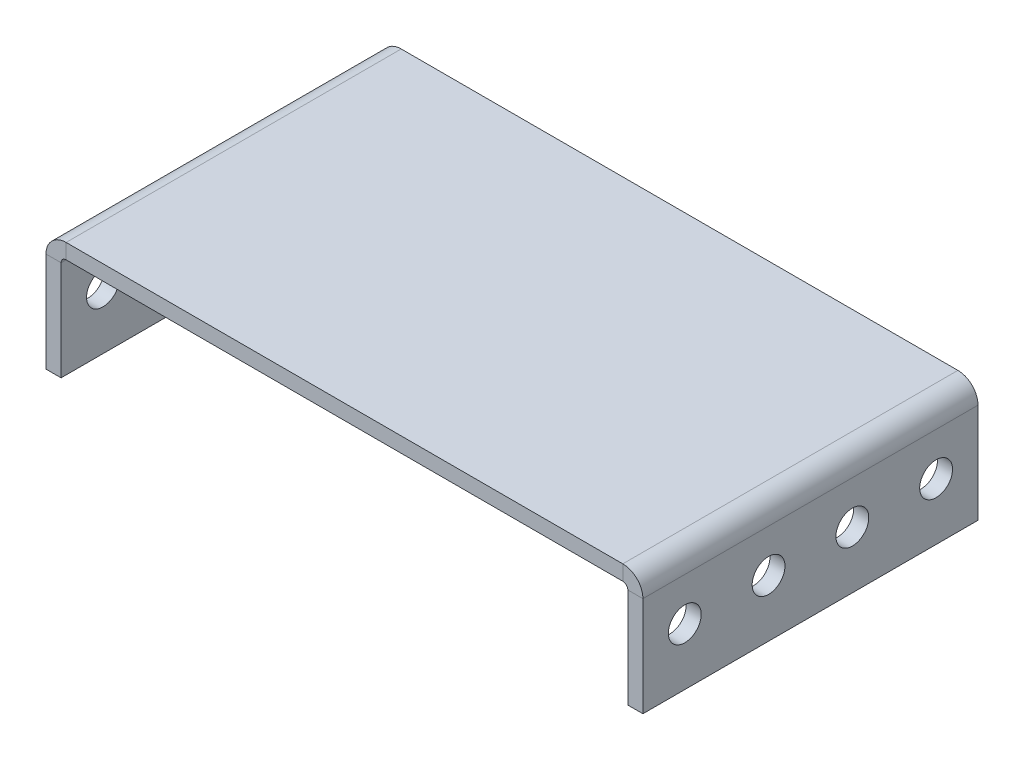
ISO-10303-21;
HEADER;
FILE_DESCRIPTION(('STEP AP214'),'2;1');
FILE_NAME('part.step','',(''),(''),'','','');
FILE_SCHEMA(('AUTOMOTIVE_DESIGN { 1 0 10303 214 1 1 1 1 }'));
ENDSEC;
DATA;
#1=APPLICATION_CONTEXT('core data for automotive mechanical design processes');
#2=APPLICATION_PROTOCOL_DEFINITION('international standard','automotive_design',2000,#1);
#3=PRODUCT_CONTEXT('',#1,'mechanical');
#4=PRODUCT('Part','Part','',(#3));
#5=PRODUCT_RELATED_PRODUCT_CATEGORY('part','',(#4));
#6=PRODUCT_DEFINITION_FORMATION('','',#4);
#7=PRODUCT_DEFINITION_CONTEXT('part definition',#1,'design');
#8=PRODUCT_DEFINITION('design','',#6,#7);
#9=PRODUCT_DEFINITION_SHAPE('','',#8);
#10=(LENGTH_UNIT() NAMED_UNIT(*) SI_UNIT(.MILLI.,.METRE.));
#11=(NAMED_UNIT(*) PLANE_ANGLE_UNIT() SI_UNIT($,.RADIAN.));
#12=(NAMED_UNIT(*) SI_UNIT($,.STERADIAN.) SOLID_ANGLE_UNIT());
#13=UNCERTAINTY_MEASURE_WITH_UNIT(LENGTH_MEASURE(1.E-05),#10,'distance_accuracy_value','');
#14=(GEOMETRIC_REPRESENTATION_CONTEXT(3) GLOBAL_UNCERTAINTY_ASSIGNED_CONTEXT((#13)) GLOBAL_UNIT_ASSIGNED_CONTEXT((#10,
#11,#12)) REPRESENTATION_CONTEXT('',''));
#15=CARTESIAN_POINT('',(0.,0.,0.));
#16=DIRECTION('',(0.,0.,1.));
#17=DIRECTION('',(1.,0.,0.));
#18=AXIS2_PLACEMENT_3D('',#15,#16,#17);
#19=CARTESIAN_POINT('',(42.1957499999999,7.93749999999999,50.8));
#20=DIRECTION('',(0.,0.,1.));
#21=DIRECTION('',(1.,0.,0.));
#22=AXIS2_PLACEMENT_3D('',#19,#20,#21);
#23=PLANE('',#22);
#24=DIRECTION('',(0.,1.,0.));
#25=VECTOR('',#24,1.);
#26=CARTESIAN_POINT('',(42.1957499999999,7.93749999999999,50.8));
#27=LINE('',#26,#25);
#28=CARTESIAN_POINT('',(42.1957499999999,7.93749999999999,50.8));
#29=VERTEX_POINT('',#28);
#30=CARTESIAN_POINT('',(42.1957499999999,10.2235,50.8));
#31=VERTEX_POINT('',#30);
#32=EDGE_CURVE('E11',#29,#31,#27,.T.);
#33=ORIENTED_EDGE('',*,*,#32,.F.);
#34=CARTESIAN_POINT('',(42.19575,7.17549999999999,50.8));
#35=DIRECTION('',(0.,0.,-1.));
#36=DIRECTION('',(-1.,0.,0.));
#37=AXIS2_PLACEMENT_3D('',#34,#35,#36);
#38=CIRCLE('',#37,0.762);
#39=CARTESIAN_POINT('',(42.95775,7.17549999999999,50.8));
#40=VERTEX_POINT('',#39);
#41=EDGE_CURVE('E255',#40,#29,#38,.F.);
#42=ORIENTED_EDGE('',*,*,#41,.F.);
#43=DIRECTION('',(-1.,0.,0.));
#44=VECTOR('',#43,1.);
#45=CARTESIAN_POINT('',(45.24375,7.17549999999999,50.8));
#46=LINE('',#45,#44);
#47=CARTESIAN_POINT('',(45.24375,7.17549999999999,50.8));
#48=VERTEX_POINT('',#47);
#49=EDGE_CURVE('E52',#48,#40,#46,.T.);
#50=ORIENTED_EDGE('',*,*,#49,.F.);
#51=CARTESIAN_POINT('',(42.19575,7.17549999999999,50.8));
#52=DIRECTION('',(0.,0.,1.));
#53=DIRECTION('',(1.,0.,0.));
#54=AXIS2_PLACEMENT_3D('',#51,#52,#53);
#55=CIRCLE('',#54,3.048);
#56=EDGE_CURVE('E153',#48,#31,#55,.T.);
#57=ORIENTED_EDGE('',*,*,#56,.T.);
#58=EDGE_LOOP('',(#33,#42,#50,#57));
#59=FACE_BOUND('',#58,.T.);
#60=ADVANCED_FACE('F44',(#59),#23,.T.);
#61=CARTESIAN_POINT('',(45.24375,7.17549999999999,50.8));
#62=DIRECTION('',(0.,0.,1.));
#63=DIRECTION('',(1.,0.,0.));
#64=AXIS2_PLACEMENT_3D('',#61,#62,#63);
#65=PLANE('',#64);
#66=DIRECTION('',(-1.,0.,0.));
#67=VECTOR('',#66,1.);
#68=CARTESIAN_POINT('',(-42.95775,7.9375,50.8));
#69=LINE('',#68,#67);
#70=CARTESIAN_POINT('',(-42.19575,7.9375,50.8));
#71=VERTEX_POINT('',#70);
#72=EDGE_CURVE('E147',#29,#71,#69,.T.);
#73=ORIENTED_EDGE('',*,*,#72,.F.);
#74=ORIENTED_EDGE('',*,*,#32,.T.);
#75=DIRECTION('',(-1.,0.,0.));
#76=VECTOR('',#75,1.);
#77=CARTESIAN_POINT('',(-42.95775,10.2235,50.8));
#78=LINE('',#77,#76);
#79=CARTESIAN_POINT('',(-42.19575,10.2235,50.8));
#80=VERTEX_POINT('',#79);
#81=EDGE_CURVE('E144',#31,#80,#78,.T.);
#82=ORIENTED_EDGE('',*,*,#81,.T.);
#83=DIRECTION('',(0.,-1.,0.));
#84=VECTOR('',#83,1.);
#85=CARTESIAN_POINT('',(-42.19575,10.2235,50.8));
#86=LINE('',#85,#84);
#87=EDGE_CURVE('E236',#80,#71,#86,.T.);
#88=ORIENTED_EDGE('',*,*,#87,.T.);
#89=EDGE_LOOP('',(#73,#74,#82,#88));
#90=FACE_BOUND('',#89,.T.);
#91=ADVANCED_FACE('F142',(#90),#65,.T.);
#92=CARTESIAN_POINT('',(42.95775,7.17549999999999,0.));
#93=DIRECTION('',(0.,0.,-1.));
#94=DIRECTION('',(-1.,0.,0.));
#95=AXIS2_PLACEMENT_3D('',#92,#93,#94);
#96=PLANE('',#95);
#97=DIRECTION('',(1.,0.,0.));
#98=VECTOR('',#97,1.);
#99=CARTESIAN_POINT('',(42.95775,7.17549999999999,0.));
#100=LINE('',#99,#98);
#101=CARTESIAN_POINT('',(42.95775,7.17549999999999,0.));
#102=VERTEX_POINT('',#101);
#103=CARTESIAN_POINT('',(45.24375,7.17549999999999,0.));
#104=VERTEX_POINT('',#103);
#105=EDGE_CURVE('E241',#102,#104,#100,.T.);
#106=ORIENTED_EDGE('',*,*,#105,.F.);
#107=CARTESIAN_POINT('',(42.19575,7.17549999999999,0.));
#108=DIRECTION('',(0.,0.,-1.));
#109=DIRECTION('',(-1.,0.,0.));
#110=AXIS2_PLACEMENT_3D('',#107,#108,#109);
#111=CIRCLE('',#110,0.762);
#112=CARTESIAN_POINT('',(42.1957499999999,7.93749999999999,0.));
#113=VERTEX_POINT('',#112);
#114=EDGE_CURVE('E193',#102,#113,#111,.F.);
#115=ORIENTED_EDGE('',*,*,#114,.T.);
#116=DIRECTION('',(0.,-1.,0.));
#117=VECTOR('',#116,1.);
#118=CARTESIAN_POINT('',(42.1957499999999,10.2235,0.));
#119=LINE('',#118,#117);
#120=CARTESIAN_POINT('',(42.1957499999999,10.2235,0.));
#121=VERTEX_POINT('',#120);
#122=EDGE_CURVE('E239',#121,#113,#119,.T.);
#123=ORIENTED_EDGE('',*,*,#122,.F.);
#124=CARTESIAN_POINT('',(42.19575,7.17549999999999,0.));
#125=DIRECTION('',(0.,0.,1.));
#126=DIRECTION('',(1.,0.,0.));
#127=AXIS2_PLACEMENT_3D('',#124,#125,#126);
#128=CIRCLE('',#127,3.048);
#129=EDGE_CURVE('E165',#104,#121,#128,.T.);
#130=ORIENTED_EDGE('',*,*,#129,.F.);
#131=EDGE_LOOP('',(#106,#115,#123,#130));
#132=FACE_BOUND('',#131,.T.);
#133=ADVANCED_FACE('F340',(#132),#96,.T.);
#134=CARTESIAN_POINT('',(42.1957499999999,10.2235,0.));
#135=DIRECTION('',(0.,0.,-1.));
#136=DIRECTION('',(-1.,0.,0.));
#137=AXIS2_PLACEMENT_3D('',#134,#135,#136);
#138=PLANE('',#137);
#139=DIRECTION('',(0.,1.,0.));
#140=VECTOR('',#139,1.);
#141=CARTESIAN_POINT('',(42.95775,7.93749999999999,0.));
#142=LINE('',#141,#140);
#143=CARTESIAN_POINT('',(42.95775,-7.93749999999999,0.));
#144=VERTEX_POINT('',#143);
#145=EDGE_CURVE('E196',#144,#102,#142,.T.);
#146=ORIENTED_EDGE('',*,*,#145,.T.);
#147=ORIENTED_EDGE('',*,*,#105,.T.);
#148=DIRECTION('',(0.,1.,0.));
#149=VECTOR('',#148,1.);
#150=CARTESIAN_POINT('',(45.24375,7.93749999999999,0.));
#151=LINE('',#150,#149);
#152=CARTESIAN_POINT('',(45.24375,-7.93749999999999,0.));
#153=VERTEX_POINT('',#152);
#154=EDGE_CURVE('E202',#153,#104,#151,.T.);
#155=ORIENTED_EDGE('',*,*,#154,.F.);
#156=DIRECTION('',(-1.,0.,0.));
#157=VECTOR('',#156,1.);
#158=CARTESIAN_POINT('',(45.24375,-7.93749999999999,0.));
#159=LINE('',#158,#157);
#160=EDGE_CURVE('E199',#153,#144,#159,.T.);
#161=ORIENTED_EDGE('',*,*,#160,.T.);
#162=EDGE_LOOP('',(#146,#147,#155,#161));
#163=FACE_BOUND('',#162,.T.);
#164=ADVANCED_FACE('F387',(#163),#138,.T.);
#165=CARTESIAN_POINT('',(-42.95775,7.1755,50.8));
#166=DIRECTION('',(0.,0.,1.));
#167=DIRECTION('',(1.,0.,0.));
#168=AXIS2_PLACEMENT_3D('',#165,#166,#167);
#169=PLANE('',#168);
#170=DIRECTION('',(-1.,0.,0.));
#171=VECTOR('',#170,1.);
#172=CARTESIAN_POINT('',(-42.95775,7.1755,50.8));
#173=LINE('',#172,#171);
#174=CARTESIAN_POINT('',(-42.95775,7.1755,50.8));
#175=VERTEX_POINT('',#174);
#176=CARTESIAN_POINT('',(-45.24375,7.1755,50.8));
#177=VERTEX_POINT('',#176);
#178=EDGE_CURVE('E60',#175,#177,#173,.T.);
#179=ORIENTED_EDGE('',*,*,#178,.F.);
#180=CARTESIAN_POINT('',(-42.19575,7.1755,50.8));
#181=DIRECTION('',(0.,0.,-1.));
#182=DIRECTION('',(-1.,0.,0.));
#183=AXIS2_PLACEMENT_3D('',#180,#181,#182);
#184=CIRCLE('',#183,0.762);
#185=EDGE_CURVE('E265',#71,#175,#184,.F.);
#186=ORIENTED_EDGE('',*,*,#185,.F.);
#187=ORIENTED_EDGE('',*,*,#87,.F.);
#188=CARTESIAN_POINT('',(-42.19575,7.1755,50.8));
#189=DIRECTION('',(0.,0.,1.));
#190=DIRECTION('',(1.,0.,0.));
#191=AXIS2_PLACEMENT_3D('',#188,#189,#190);
#192=CIRCLE('',#191,3.048);
#193=EDGE_CURVE('E173',#80,#177,#192,.T.);
#194=ORIENTED_EDGE('',*,*,#193,.T.);
#195=EDGE_LOOP('',(#179,#186,#187,#194));
#196=FACE_BOUND('',#195,.T.);
#197=ADVANCED_FACE('F392',(#196),#169,.T.);
#198=CARTESIAN_POINT('',(-42.19575,10.2235,50.8));
#199=DIRECTION('',(0.,0.,1.));
#200=DIRECTION('',(1.,0.,0.));
#201=AXIS2_PLACEMENT_3D('',#198,#199,#200);
#202=PLANE('',#201);
#203=DIRECTION('',(0.,-1.,0.));
#204=VECTOR('',#203,1.);
#205=CARTESIAN_POINT('',(-42.95775,7.9375,50.8));
#206=LINE('',#205,#204);
#207=CARTESIAN_POINT('',(-42.95775,-7.9375,50.8));
#208=VERTEX_POINT('',#207);
#209=EDGE_CURVE('E268',#175,#208,#206,.T.);
#210=ORIENTED_EDGE('',*,*,#209,.F.);
#211=ORIENTED_EDGE('',*,*,#178,.T.);
#212=DIRECTION('',(0.,1.,0.));
#213=VECTOR('',#212,1.);
#214=CARTESIAN_POINT('',(-45.24375,7.9375,50.8));
#215=LINE('',#214,#213);
#216=CARTESIAN_POINT('',(-45.24375,-7.9375,50.8));
#217=VERTEX_POINT('',#216);
#218=EDGE_CURVE('E114',#177,#217,#215,.F.);
#219=ORIENTED_EDGE('',*,*,#218,.T.);
#220=DIRECTION('',(-1.,0.,0.));
#221=VECTOR('',#220,1.);
#222=CARTESIAN_POINT('',(-42.95775,-7.9375,50.8));
#223=LINE('',#222,#221);
#224=EDGE_CURVE('E271',#208,#217,#223,.T.);
#225=ORIENTED_EDGE('',*,*,#224,.F.);
#226=EDGE_LOOP('',(#210,#211,#219,#225));
#227=FACE_BOUND('',#226,.T.);
#228=ADVANCED_FACE('F364',(#227),#202,.T.);
#229=CARTESIAN_POINT('',(-42.19575,7.9375,0.));
#230=DIRECTION('',(0.,0.,-1.));
#231=DIRECTION('',(-1.,0.,0.));
#232=AXIS2_PLACEMENT_3D('',#229,#230,#231);
#233=PLANE('',#232);
#234=DIRECTION('',(0.,1.,0.));
#235=VECTOR('',#234,1.);
#236=CARTESIAN_POINT('',(-42.19575,7.9375,0.));
#237=LINE('',#236,#235);
#238=CARTESIAN_POINT('',(-42.19575,7.9375,0.));
#239=VERTEX_POINT('',#238);
#240=CARTESIAN_POINT('',(-42.19575,10.2235,0.));
#241=VERTEX_POINT('',#240);
#242=EDGE_CURVE('E101',#239,#241,#237,.T.);
#243=ORIENTED_EDGE('',*,*,#242,.F.);
#244=CARTESIAN_POINT('',(-42.19575,7.1755,0.));
#245=DIRECTION('',(0.,0.,-1.));
#246=DIRECTION('',(-1.,0.,0.));
#247=AXIS2_PLACEMENT_3D('',#244,#245,#246);
#248=CIRCLE('',#247,0.762);
#249=CARTESIAN_POINT('',(-42.95775,7.1755,0.));
#250=VERTEX_POINT('',#249);
#251=EDGE_CURVE('E189',#239,#250,#248,.F.);
#252=ORIENTED_EDGE('',*,*,#251,.T.);
#253=DIRECTION('',(1.,0.,0.));
#254=VECTOR('',#253,1.);
#255=CARTESIAN_POINT('',(-45.24375,7.1755,0.));
#256=LINE('',#255,#254);
#257=CARTESIAN_POINT('',(-45.24375,7.1755,0.));
#258=VERTEX_POINT('',#257);
#259=EDGE_CURVE('E108',#258,#250,#256,.T.);
#260=ORIENTED_EDGE('',*,*,#259,.F.);
#261=CARTESIAN_POINT('',(-42.19575,7.1755,0.));
#262=DIRECTION('',(0.,0.,1.));
#263=DIRECTION('',(1.,0.,0.));
#264=AXIS2_PLACEMENT_3D('',#261,#262,#263);
#265=CIRCLE('',#264,3.048);
#266=EDGE_CURVE('E208',#241,#258,#265,.T.);
#267=ORIENTED_EDGE('',*,*,#266,.F.);
#268=EDGE_LOOP('',(#243,#252,#260,#267));
#269=FACE_BOUND('',#268,.T.);
#270=ADVANCED_FACE('F352',(#269),#233,.T.);
#271=CARTESIAN_POINT('',(-45.24375,7.1755,0.));
#272=DIRECTION('',(0.,0.,-1.));
#273=DIRECTION('',(-1.,0.,0.));
#274=AXIS2_PLACEMENT_3D('',#271,#272,#273);
#275=PLANE('',#274);
#276=DIRECTION('',(-1.,0.,0.));
#277=VECTOR('',#276,1.);
#278=CARTESIAN_POINT('',(-42.95775,7.9375,0.));
#279=LINE('',#278,#277);
#280=EDGE_CURVE('E191',#113,#239,#279,.T.);
#281=ORIENTED_EDGE('',*,*,#280,.T.);
#282=ORIENTED_EDGE('',*,*,#242,.T.);
#283=DIRECTION('',(-1.,0.,0.));
#284=VECTOR('',#283,1.);
#285=CARTESIAN_POINT('',(-42.95775,10.2235,0.));
#286=LINE('',#285,#284);
#287=EDGE_CURVE('E206',#121,#241,#286,.T.);
#288=ORIENTED_EDGE('',*,*,#287,.F.);
#289=ORIENTED_EDGE('',*,*,#122,.T.);
#290=EDGE_LOOP('',(#281,#282,#288,#289));
#291=FACE_BOUND('',#290,.T.);
#292=ADVANCED_FACE('F341',(#291),#275,.T.);
#293=CARTESIAN_POINT('',(-45.24375,7.9375,50.8));
#294=DIRECTION('',(1.,0.,0.));
#295=DIRECTION('',(0.,0.,-1.));
#296=AXIS2_PLACEMENT_3D('',#293,#294,#295);
#297=PLANE('',#296);
#298=CARTESIAN_POINT('',(-45.24375,0.698499999999999,6.35));
#299=DIRECTION('',(1.,0.,0.));
#300=DIRECTION('',(0.,0.,-1.));
#301=AXIS2_PLACEMENT_3D('',#298,#299,#300);
#302=CIRCLE('',#301,2.4892);
#303=CARTESIAN_POINT('',(-45.24375,0.698499999999999,3.8608));
#304=VERTEX_POINT('',#303);
#305=EDGE_CURVE('E298',#304,#304,#302,.T.);
#306=ORIENTED_EDGE('',*,*,#305,.T.);
#307=EDGE_LOOP('',(#306));
#308=FACE_BOUND('',#307,.T.);
#309=CARTESIAN_POINT('',(-45.24375,0.698499999999999,19.05));
#310=DIRECTION('',(1.,0.,0.));
#311=DIRECTION('',(0.,0.,-1.));
#312=AXIS2_PLACEMENT_3D('',#309,#310,#311);
#313=CIRCLE('',#312,2.4892);
#314=CARTESIAN_POINT('',(-45.24375,0.698499999999999,16.5608));
#315=VERTEX_POINT('',#314);
#316=EDGE_CURVE('E309',#315,#315,#313,.T.);
#317=ORIENTED_EDGE('',*,*,#316,.T.);
#318=EDGE_LOOP('',(#317));
#319=FACE_BOUND('',#318,.T.);
#320=CARTESIAN_POINT('',(-45.24375,0.698499999999999,31.75));
#321=DIRECTION('',(1.,0.,0.));
#322=DIRECTION('',(0.,0.,-1.));
#323=AXIS2_PLACEMENT_3D('',#320,#321,#322);
#324=CIRCLE('',#323,2.4892);
#325=CARTESIAN_POINT('',(-45.24375,0.698499999999999,29.2608));
#326=VERTEX_POINT('',#325);
#327=EDGE_CURVE('E302',#326,#326,#324,.T.);
#328=ORIENTED_EDGE('',*,*,#327,.T.);
#329=EDGE_LOOP('',(#328));
#330=FACE_BOUND('',#329,.T.);
#331=CARTESIAN_POINT('',(-45.24375,0.698499999999999,44.45));
#332=DIRECTION('',(1.,0.,0.));
#333=DIRECTION('',(0.,0.,-1.));
#334=AXIS2_PLACEMENT_3D('',#331,#332,#333);
#335=CIRCLE('',#334,2.4892);
#336=CARTESIAN_POINT('',(-45.24375,0.698499999999999,41.9608));
#337=VERTEX_POINT('',#336);
#338=EDGE_CURVE('E303',#337,#337,#335,.T.);
#339=ORIENTED_EDGE('',*,*,#338,.T.);
#340=EDGE_LOOP('',(#339));
#341=FACE_BOUND('',#340,.T.);
#342=DIRECTION('',(0.,1.,0.));
#343=VECTOR('',#342,1.);
#344=CARTESIAN_POINT('',(-45.24375,7.9375,0.));
#345=LINE('',#344,#343);
#346=CARTESIAN_POINT('',(-45.24375,-7.9375,0.));
#347=VERTEX_POINT('',#346);
#348=EDGE_CURVE('E179',#258,#347,#345,.F.);
#349=ORIENTED_EDGE('',*,*,#348,.T.);
#350=DIRECTION('',(0.,0.,-1.));
#351=VECTOR('',#350,1.);
#352=CARTESIAN_POINT('',(-45.24375,-7.9375,50.8));
#353=LINE('',#352,#351);
#354=EDGE_CURVE('E232',#217,#347,#353,.T.);
#355=ORIENTED_EDGE('',*,*,#354,.F.);
#356=ORIENTED_EDGE('',*,*,#218,.F.);
#357=DIRECTION('',(0.,0.,-1.));
#358=VECTOR('',#357,1.);
#359=CARTESIAN_POINT('',(-45.24375,7.1755,50.8));
#360=LINE('',#359,#358);
#361=EDGE_CURVE('E175',#177,#258,#360,.T.);
#362=ORIENTED_EDGE('',*,*,#361,.T.);
#363=EDGE_LOOP('',(#349,#355,#356,#362));
#364=FACE_BOUND('',#363,.T.);
#365=ADVANCED_FACE('F358',(#308,#319,#330,#341,#364),#297,.F.);
#366=CARTESIAN_POINT('',(-42.95775,-7.9375,50.8));
#367=DIRECTION('',(0.,-1.,0.));
#368=DIRECTION('',(0.,0.,-1.));
#369=AXIS2_PLACEMENT_3D('',#366,#367,#368);
#370=PLANE('',#369);
#371=DIRECTION('',(-1.,0.,0.));
#372=VECTOR('',#371,1.);
#373=CARTESIAN_POINT('',(-42.95775,-7.9375,0.));
#374=LINE('',#373,#372);
#375=CARTESIAN_POINT('',(-42.95775,-7.9375,0.));
#376=VERTEX_POINT('',#375);
#377=EDGE_CURVE('E182',#376,#347,#374,.T.);
#378=ORIENTED_EDGE('',*,*,#377,.F.);
#379=DIRECTION('',(0.,0.,-1.));
#380=VECTOR('',#379,1.);
#381=CARTESIAN_POINT('',(-42.95775,-7.9375,50.8));
#382=LINE('',#381,#380);
#383=EDGE_CURVE('E230',#208,#376,#382,.T.);
#384=ORIENTED_EDGE('',*,*,#383,.F.);
#385=ORIENTED_EDGE('',*,*,#224,.T.);
#386=ORIENTED_EDGE('',*,*,#354,.T.);
#387=EDGE_LOOP('',(#378,#384,#385,#386));
#388=FACE_BOUND('',#387,.T.);
#389=ADVANCED_FACE('F363',(#388),#370,.T.);
#390=CARTESIAN_POINT('',(-42.95775,7.9375,50.8));
#391=DIRECTION('',(1.,0.,0.));
#392=DIRECTION('',(0.,0.,-1.));
#393=AXIS2_PLACEMENT_3D('',#390,#391,#392);
#394=PLANE('',#393);
#395=CARTESIAN_POINT('',(-42.95775,0.698499999999999,6.35));
#396=DIRECTION('',(1.,0.,0.));
#397=DIRECTION('',(0.,0.,-1.));
#398=AXIS2_PLACEMENT_3D('',#395,#396,#397);
#399=CIRCLE('',#398,2.4892);
#400=CARTESIAN_POINT('',(-42.95775,0.698499999999999,3.8608));
#401=VERTEX_POINT('',#400);
#402=EDGE_CURVE('E183',#401,#401,#399,.T.);
#403=ORIENTED_EDGE('',*,*,#402,.F.);
#404=EDGE_LOOP('',(#403));
#405=FACE_BOUND('',#404,.T.);
#406=CARTESIAN_POINT('',(-42.95775,0.698499999999999,19.05));
#407=DIRECTION('',(1.,0.,0.));
#408=DIRECTION('',(0.,0.,-1.));
#409=AXIS2_PLACEMENT_3D('',#406,#407,#408);
#410=CIRCLE('',#409,2.4892);
#411=CARTESIAN_POINT('',(-42.95775,0.698499999999999,16.5608));
#412=VERTEX_POINT('',#411);
#413=EDGE_CURVE('E280',#412,#412,#410,.T.);
#414=ORIENTED_EDGE('',*,*,#413,.F.);
#415=EDGE_LOOP('',(#414));
#416=FACE_BOUND('',#415,.T.);
#417=CARTESIAN_POINT('',(-42.95775,0.698499999999999,31.75));
#418=DIRECTION('',(1.,0.,0.));
#419=DIRECTION('',(0.,0.,-1.));
#420=AXIS2_PLACEMENT_3D('',#417,#418,#419);
#421=CIRCLE('',#420,2.4892);
#422=CARTESIAN_POINT('',(-42.95775,0.698499999999999,29.2608));
#423=VERTEX_POINT('',#422);
#424=EDGE_CURVE('E286',#423,#423,#421,.T.);
#425=ORIENTED_EDGE('',*,*,#424,.F.);
#426=EDGE_LOOP('',(#425));
#427=FACE_BOUND('',#426,.T.);
#428=CARTESIAN_POINT('',(-42.95775,0.698499999999999,44.45));
#429=DIRECTION('',(1.,0.,0.));
#430=DIRECTION('',(0.,0.,-1.));
#431=AXIS2_PLACEMENT_3D('',#428,#429,#430);
#432=CIRCLE('',#431,2.4892);
#433=CARTESIAN_POINT('',(-42.95775,0.698499999999999,41.9608));
#434=VERTEX_POINT('',#433);
#435=EDGE_CURVE('E292',#434,#434,#432,.T.);
#436=ORIENTED_EDGE('',*,*,#435,.F.);
#437=EDGE_LOOP('',(#436));
#438=FACE_BOUND('',#437,.T.);
#439=DIRECTION('',(0.,-1.,0.));
#440=VECTOR('',#439,1.);
#441=CARTESIAN_POINT('',(-42.95775,7.9375,0.));
#442=LINE('',#441,#440);
#443=EDGE_CURVE('E186',#250,#376,#442,.T.);
#444=ORIENTED_EDGE('',*,*,#443,.F.);
#445=DIRECTION('',(0.,0.,-1.));
#446=VECTOR('',#445,1.);
#447=CARTESIAN_POINT('',(-42.95775,7.1755,50.8));
#448=LINE('',#447,#446);
#449=EDGE_CURVE('E227',#175,#250,#448,.T.);
#450=ORIENTED_EDGE('',*,*,#449,.F.);
#451=ORIENTED_EDGE('',*,*,#209,.T.);
#452=ORIENTED_EDGE('',*,*,#383,.T.);
#453=EDGE_LOOP('',(#444,#450,#451,#452));
#454=FACE_BOUND('',#453,.T.);
#455=ADVANCED_FACE('F366',(#405,#416,#427,#438,#454),#394,.T.);
#456=CARTESIAN_POINT('',(-42.19575,7.1755,50.8));
#457=DIRECTION('',(0.,0.,-1.));
#458=DIRECTION('',(-1.,0.,0.));
#459=AXIS2_PLACEMENT_3D('',#456,#457,#458);
#460=CYLINDRICAL_SURFACE('',#459,0.762);
#461=ORIENTED_EDGE('',*,*,#251,.F.);
#462=DIRECTION('',(0.,0.,-1.));
#463=VECTOR('',#462,1.);
#464=CARTESIAN_POINT('',(-42.19575,7.9375,50.8));
#465=LINE('',#464,#463);
#466=EDGE_CURVE('E224',#71,#239,#465,.T.);
#467=ORIENTED_EDGE('',*,*,#466,.F.);
#468=ORIENTED_EDGE('',*,*,#185,.T.);
#469=ORIENTED_EDGE('',*,*,#449,.T.);
#470=EDGE_LOOP('',(#461,#467,#468,#469));
#471=FACE_BOUND('',#470,.T.);
#472=ADVANCED_FACE('F349',(#471),#460,.F.);
#473=CARTESIAN_POINT('',(-42.95775,7.9375,50.8));
#474=DIRECTION('',(0.,-1.,0.));
#475=DIRECTION('',(1.,0.,0.));
#476=AXIS2_PLACEMENT_3D('',#473,#474,#475);
#477=PLANE('',#476);
#478=ORIENTED_EDGE('',*,*,#280,.F.);
#479=DIRECTION('',(0.,0.,-1.));
#480=VECTOR('',#479,1.);
#481=CARTESIAN_POINT('',(42.1957499999999,7.93749999999999,50.8));
#482=LINE('',#481,#480);
#483=EDGE_CURVE('E221',#29,#113,#482,.T.);
#484=ORIENTED_EDGE('',*,*,#483,.F.);
#485=ORIENTED_EDGE('',*,*,#72,.T.);
#486=ORIENTED_EDGE('',*,*,#466,.T.);
#487=EDGE_LOOP('',(#478,#484,#485,#486));
#488=FACE_BOUND('',#487,.T.);
#489=ADVANCED_FACE('F344',(#488),#477,.T.);
#490=CARTESIAN_POINT('',(42.19575,7.17549999999999,50.8));
#491=DIRECTION('',(0.,0.,-1.));
#492=DIRECTION('',(-1.,0.,0.));
#493=AXIS2_PLACEMENT_3D('',#490,#491,#492);
#494=CYLINDRICAL_SURFACE('',#493,0.762);
#495=ORIENTED_EDGE('',*,*,#114,.F.);
#496=DIRECTION('',(0.,0.,-1.));
#497=VECTOR('',#496,1.);
#498=CARTESIAN_POINT('',(42.95775,7.17549999999999,50.8));
#499=LINE('',#498,#497);
#500=EDGE_CURVE('E218',#40,#102,#499,.T.);
#501=ORIENTED_EDGE('',*,*,#500,.F.);
#502=ORIENTED_EDGE('',*,*,#41,.T.);
#503=ORIENTED_EDGE('',*,*,#483,.T.);
#504=EDGE_LOOP('',(#495,#501,#502,#503));
#505=FACE_BOUND('',#504,.T.);
#506=ADVANCED_FACE('F254',(#505),#494,.F.);
#507=CARTESIAN_POINT('',(42.95775,7.93749999999999,50.8));
#508=DIRECTION('',(-1.,0.,0.));
#509=DIRECTION('',(0.,0.,1.));
#510=AXIS2_PLACEMENT_3D('',#507,#508,#509);
#511=PLANE('',#510);
#512=CARTESIAN_POINT('',(42.95775,0.698499999999999,6.35));
#513=DIRECTION('',(-1.,0.,0.));
#514=DIRECTION('',(0.,0.,1.));
#515=AXIS2_PLACEMENT_3D('',#512,#513,#514);
#516=CIRCLE('',#515,2.4892);
#517=CARTESIAN_POINT('',(42.95775,0.698499999999999,8.8392));
#518=VERTEX_POINT('',#517);
#519=EDGE_CURVE('E277',#518,#518,#516,.T.);
#520=ORIENTED_EDGE('',*,*,#519,.F.);
#521=EDGE_LOOP('',(#520));
#522=FACE_BOUND('',#521,.T.);
#523=CARTESIAN_POINT('',(42.95775,0.698499999999999,19.05));
#524=DIRECTION('',(-1.,0.,0.));
#525=DIRECTION('',(0.,0.,1.));
#526=AXIS2_PLACEMENT_3D('',#523,#524,#525);
#527=CIRCLE('',#526,2.4892);
#528=CARTESIAN_POINT('',(42.95775,0.698499999999999,21.5392));
#529=VERTEX_POINT('',#528);
#530=EDGE_CURVE('E283',#529,#529,#527,.T.);
#531=ORIENTED_EDGE('',*,*,#530,.F.);
#532=EDGE_LOOP('',(#531));
#533=FACE_BOUND('',#532,.T.);
#534=CARTESIAN_POINT('',(42.95775,0.698499999999999,31.75));
#535=DIRECTION('',(-1.,0.,0.));
#536=DIRECTION('',(0.,0.,1.));
#537=AXIS2_PLACEMENT_3D('',#534,#535,#536);
#538=CIRCLE('',#537,2.4892);
#539=CARTESIAN_POINT('',(42.95775,0.698499999999999,34.2392));
#540=VERTEX_POINT('',#539);
#541=EDGE_CURVE('E289',#540,#540,#538,.T.);
#542=ORIENTED_EDGE('',*,*,#541,.F.);
#543=EDGE_LOOP('',(#542));
#544=FACE_BOUND('',#543,.T.);
#545=CARTESIAN_POINT('',(42.95775,0.698499999999999,44.45));
#546=DIRECTION('',(-1.,0.,0.));
#547=DIRECTION('',(0.,0.,1.));
#548=AXIS2_PLACEMENT_3D('',#545,#546,#547);
#549=CIRCLE('',#548,2.4892);
#550=CARTESIAN_POINT('',(42.95775,0.698499999999999,46.9392));
#551=VERTEX_POINT('',#550);
#552=EDGE_CURVE('E295',#551,#551,#549,.T.);
#553=ORIENTED_EDGE('',*,*,#552,.F.);
#554=EDGE_LOOP('',(#553));
#555=FACE_BOUND('',#554,.T.);
#556=ORIENTED_EDGE('',*,*,#145,.F.);
#557=DIRECTION('',(0.,0.,-1.));
#558=VECTOR('',#557,1.);
#559=CARTESIAN_POINT('',(42.95775,-7.93749999999999,50.8));
#560=LINE('',#559,#558);
#561=CARTESIAN_POINT('',(42.95775,-7.93749999999999,50.8));
#562=VERTEX_POINT('',#561);
#563=EDGE_CURVE('E216',#562,#144,#560,.T.);
#564=ORIENTED_EDGE('',*,*,#563,.F.);
#565=DIRECTION('',(0.,1.,0.));
#566=VECTOR('',#565,1.);
#567=CARTESIAN_POINT('',(42.95775,7.93749999999999,50.8));
#568=LINE('',#567,#566);
#569=EDGE_CURVE('E248',#562,#40,#568,.T.);
#570=ORIENTED_EDGE('',*,*,#569,.T.);
#571=ORIENTED_EDGE('',*,*,#500,.T.);
#572=EDGE_LOOP('',(#556,#564,#570,#571));
#573=FACE_BOUND('',#572,.T.);
#574=ADVANCED_FACE('F259',(#522,#533,#544,#555,#573),#511,.T.);
#575=CARTESIAN_POINT('',(45.24375,-7.93749999999999,50.8));
#576=DIRECTION('',(0.,-1.,0.));
#577=DIRECTION('',(0.,0.,-1.));
#578=AXIS2_PLACEMENT_3D('',#575,#576,#577);
#579=PLANE('',#578);
#580=ORIENTED_EDGE('',*,*,#160,.F.);
#581=DIRECTION('',(0.,0.,-1.));
#582=VECTOR('',#581,1.);
#583=CARTESIAN_POINT('',(45.24375,-7.93749999999999,50.8));
#584=LINE('',#583,#582);
#585=CARTESIAN_POINT('',(45.24375,-7.93749999999999,50.8));
#586=VERTEX_POINT('',#585);
#587=EDGE_CURVE('E214',#586,#153,#584,.T.);
#588=ORIENTED_EDGE('',*,*,#587,.F.);
#589=DIRECTION('',(-1.,0.,0.));
#590=VECTOR('',#589,1.);
#591=CARTESIAN_POINT('',(45.24375,-7.93749999999999,50.8));
#592=LINE('',#591,#590);
#593=EDGE_CURVE('E260',#586,#562,#592,.T.);
#594=ORIENTED_EDGE('',*,*,#593,.T.);
#595=ORIENTED_EDGE('',*,*,#563,.T.);
#596=EDGE_LOOP('',(#580,#588,#594,#595));
#597=FACE_BOUND('',#596,.T.);
#598=ADVANCED_FACE('F328',(#597),#579,.T.);
#599=CARTESIAN_POINT('',(45.24375,7.93749999999999,50.8));
#600=DIRECTION('',(-1.,0.,0.));
#601=DIRECTION('',(0.,0.,1.));
#602=AXIS2_PLACEMENT_3D('',#599,#600,#601);
#603=PLANE('',#602);
#604=CARTESIAN_POINT('',(45.24375,0.698499999999999,6.35));
#605=DIRECTION('',(1.,0.,0.));
#606=DIRECTION('',(0.,0.,-1.));
#607=AXIS2_PLACEMENT_3D('',#604,#605,#606);
#608=CIRCLE('',#607,2.4892);
#609=CARTESIAN_POINT('',(45.24375,0.698499999999999,3.8608));
#610=VERTEX_POINT('',#609);
#611=EDGE_CURVE('E315',#610,#610,#608,.T.);
#612=ORIENTED_EDGE('',*,*,#611,.F.);
#613=EDGE_LOOP('',(#612));
#614=FACE_BOUND('',#613,.T.);
#615=CARTESIAN_POINT('',(45.24375,0.698499999999999,19.05));
#616=DIRECTION('',(1.,0.,0.));
#617=DIRECTION('',(0.,0.,-1.));
#618=AXIS2_PLACEMENT_3D('',#615,#616,#617);
#619=CIRCLE('',#618,2.4892);
#620=CARTESIAN_POINT('',(45.24375,0.698499999999999,16.5608));
#621=VERTEX_POINT('',#620);
#622=EDGE_CURVE('E312',#621,#621,#619,.T.);
#623=ORIENTED_EDGE('',*,*,#622,.F.);
#624=EDGE_LOOP('',(#623));
#625=FACE_BOUND('',#624,.T.);
#626=CARTESIAN_POINT('',(45.24375,0.698499999999999,31.75));
#627=DIRECTION('',(1.,0.,0.));
#628=DIRECTION('',(0.,0.,-1.));
#629=AXIS2_PLACEMENT_3D('',#626,#627,#628);
#630=CIRCLE('',#629,2.4892);
#631=CARTESIAN_POINT('',(45.24375,0.698499999999999,29.2608));
#632=VERTEX_POINT('',#631);
#633=EDGE_CURVE('E306',#632,#632,#630,.T.);
#634=ORIENTED_EDGE('',*,*,#633,.F.);
#635=EDGE_LOOP('',(#634));
#636=FACE_BOUND('',#635,.T.);
#637=CARTESIAN_POINT('',(45.24375,0.698499999999999,44.45));
#638=DIRECTION('',(1.,0.,0.));
#639=DIRECTION('',(0.,0.,-1.));
#640=AXIS2_PLACEMENT_3D('',#637,#638,#639);
#641=CIRCLE('',#640,2.4892);
#642=CARTESIAN_POINT('',(45.24375,0.698499999999999,41.9608));
#643=VERTEX_POINT('',#642);
#644=EDGE_CURVE('E299',#643,#643,#641,.T.);
#645=ORIENTED_EDGE('',*,*,#644,.F.);
#646=EDGE_LOOP('',(#645));
#647=FACE_BOUND('',#646,.T.);
#648=ORIENTED_EDGE('',*,*,#154,.T.);
#649=DIRECTION('',(0.,0.,-1.));
#650=VECTOR('',#649,1.);
#651=CARTESIAN_POINT('',(45.24375,7.17549999999999,50.8));
#652=LINE('',#651,#650);
#653=EDGE_CURVE('E167',#48,#104,#652,.T.);
#654=ORIENTED_EDGE('',*,*,#653,.F.);
#655=DIRECTION('',(0.,1.,0.));
#656=VECTOR('',#655,1.);
#657=CARTESIAN_POINT('',(45.24375,7.93749999999999,50.8));
#658=LINE('',#657,#656);
#659=EDGE_CURVE('E158',#586,#48,#658,.T.);
#660=ORIENTED_EDGE('',*,*,#659,.F.);
#661=ORIENTED_EDGE('',*,*,#587,.T.);
#662=EDGE_LOOP('',(#648,#654,#660,#661));
#663=FACE_BOUND('',#662,.T.);
#664=ADVANCED_FACE('F325',(#614,#625,#636,#647,#663),#603,.F.);
#665=CARTESIAN_POINT('',(42.19575,7.17549999999999,50.8));
#666=DIRECTION('',(0.,0.,-1.));
#667=DIRECTION('',(-1.,0.,0.));
#668=AXIS2_PLACEMENT_3D('',#665,#666,#667);
#669=CYLINDRICAL_SURFACE('',#668,3.048);
#670=ORIENTED_EDGE('',*,*,#129,.T.);
#671=DIRECTION('',(0.,0.,-1.));
#672=VECTOR('',#671,1.);
#673=CARTESIAN_POINT('',(42.1957499999999,10.2235,50.8));
#674=LINE('',#673,#672);
#675=EDGE_CURVE('E162',#31,#121,#674,.T.);
#676=ORIENTED_EDGE('',*,*,#675,.F.);
#677=ORIENTED_EDGE('',*,*,#56,.F.);
#678=ORIENTED_EDGE('',*,*,#653,.T.);
#679=EDGE_LOOP('',(#670,#676,#677,#678));
#680=FACE_BOUND('',#679,.T.);
#681=ADVANCED_FACE('F163',(#680),#669,.T.);
#682=CARTESIAN_POINT('',(-42.95775,10.2235,50.8));
#683=DIRECTION('',(0.,-1.,0.));
#684=DIRECTION('',(1.,0.,0.));
#685=AXIS2_PLACEMENT_3D('',#682,#683,#684);
#686=PLANE('',#685);
#687=ORIENTED_EDGE('',*,*,#287,.T.);
#688=DIRECTION('',(0.,0.,-1.));
#689=VECTOR('',#688,1.);
#690=CARTESIAN_POINT('',(-42.19575,10.2235,50.8));
#691=LINE('',#690,#689);
#692=EDGE_CURVE('E168',#80,#241,#691,.T.);
#693=ORIENTED_EDGE('',*,*,#692,.F.);
#694=ORIENTED_EDGE('',*,*,#81,.F.);
#695=ORIENTED_EDGE('',*,*,#675,.T.);
#696=EDGE_LOOP('',(#687,#693,#694,#695));
#697=FACE_BOUND('',#696,.T.);
#698=ADVANCED_FACE('F170',(#697),#686,.F.);
#699=CARTESIAN_POINT('',(-42.19575,7.1755,50.8));
#700=DIRECTION('',(0.,0.,-1.));
#701=DIRECTION('',(-1.,0.,0.));
#702=AXIS2_PLACEMENT_3D('',#699,#700,#701);
#703=CYLINDRICAL_SURFACE('',#702,3.048);
#704=ORIENTED_EDGE('',*,*,#266,.T.);
#705=ORIENTED_EDGE('',*,*,#361,.F.);
#706=ORIENTED_EDGE('',*,*,#193,.F.);
#707=ORIENTED_EDGE('',*,*,#692,.T.);
#708=EDGE_LOOP('',(#704,#705,#706,#707));
#709=FACE_BOUND('',#708,.T.);
#710=ADVANCED_FACE('F355',(#709),#703,.T.);
#711=CARTESIAN_POINT('',(-42.19575,7.1755,50.8));
#712=DIRECTION('',(0.,0.,-1.));
#713=DIRECTION('',(-1.,0.,0.));
#714=AXIS2_PLACEMENT_3D('',#711,#712,#713);
#715=PLANE('',#714);
#716=ORIENTED_EDGE('',*,*,#659,.T.);
#717=ORIENTED_EDGE('',*,*,#49,.T.);
#718=ORIENTED_EDGE('',*,*,#569,.F.);
#719=ORIENTED_EDGE('',*,*,#593,.F.);
#720=EDGE_LOOP('',(#716,#717,#718,#719));
#721=FACE_BOUND('',#720,.T.);
#722=ADVANCED_FACE('F245',(#721),#715,.F.);
#723=CARTESIAN_POINT('',(-42.19575,7.1755,0.));
#724=DIRECTION('',(0.,0.,-1.));
#725=DIRECTION('',(-1.,0.,0.));
#726=AXIS2_PLACEMENT_3D('',#723,#724,#725);
#727=PLANE('',#726);
#728=ORIENTED_EDGE('',*,*,#348,.F.);
#729=ORIENTED_EDGE('',*,*,#259,.T.);
#730=ORIENTED_EDGE('',*,*,#443,.T.);
#731=ORIENTED_EDGE('',*,*,#377,.T.);
#732=EDGE_LOOP('',(#728,#729,#730,#731));
#733=FACE_BOUND('',#732,.T.);
#734=ADVANCED_FACE('F360',(#733),#727,.T.);
#735=CARTESIAN_POINT('',(-45.24375,0.698499999999999,44.45));
#736=DIRECTION('',(1.,0.,0.));
#737=DIRECTION('',(0.,0.,-1.));
#738=AXIS2_PLACEMENT_3D('',#735,#736,#737);
#739=CYLINDRICAL_SURFACE('',#738,2.4892);
#740=ORIENTED_EDGE('',*,*,#552,.T.);
#741=EDGE_LOOP('',(#740));
#742=FACE_BOUND('',#741,.T.);
#743=ORIENTED_EDGE('',*,*,#644,.T.);
#744=EDGE_LOOP('',(#743));
#745=FACE_BOUND('',#744,.T.);
#746=ADVANCED_FACE('F419',(#742,#745),#739,.F.);
#747=CARTESIAN_POINT('',(-45.24375,0.698499999999999,31.75));
#748=DIRECTION('',(1.,0.,0.));
#749=DIRECTION('',(0.,0.,-1.));
#750=AXIS2_PLACEMENT_3D('',#747,#748,#749);
#751=CYLINDRICAL_SURFACE('',#750,2.4892);
#752=ORIENTED_EDGE('',*,*,#541,.T.);
#753=EDGE_LOOP('',(#752));
#754=FACE_BOUND('',#753,.T.);
#755=ORIENTED_EDGE('',*,*,#633,.T.);
#756=EDGE_LOOP('',(#755));
#757=FACE_BOUND('',#756,.T.);
#758=ADVANCED_FACE('F427',(#754,#757),#751,.F.);
#759=CARTESIAN_POINT('',(-45.24375,0.698499999999999,19.05));
#760=DIRECTION('',(1.,0.,0.));
#761=DIRECTION('',(0.,0.,-1.));
#762=AXIS2_PLACEMENT_3D('',#759,#760,#761);
#763=CYLINDRICAL_SURFACE('',#762,2.4892);
#764=ORIENTED_EDGE('',*,*,#530,.T.);
#765=EDGE_LOOP('',(#764));
#766=FACE_BOUND('',#765,.T.);
#767=ORIENTED_EDGE('',*,*,#622,.T.);
#768=EDGE_LOOP('',(#767));
#769=FACE_BOUND('',#768,.T.);
#770=ADVANCED_FACE('F428',(#766,#769),#763,.F.);
#771=CARTESIAN_POINT('',(-45.24375,0.698499999999999,6.35));
#772=DIRECTION('',(1.,0.,0.));
#773=DIRECTION('',(0.,0.,-1.));
#774=AXIS2_PLACEMENT_3D('',#771,#772,#773);
#775=CYLINDRICAL_SURFACE('',#774,2.4892);
#776=ORIENTED_EDGE('',*,*,#519,.T.);
#777=EDGE_LOOP('',(#776));
#778=FACE_BOUND('',#777,.T.);
#779=ORIENTED_EDGE('',*,*,#611,.T.);
#780=EDGE_LOOP('',(#779));
#781=FACE_BOUND('',#780,.T.);
#782=ADVANCED_FACE('F323',(#778,#781),#775,.F.);
#783=ORIENTED_EDGE('',*,*,#435,.T.);
#784=EDGE_LOOP('',(#783));
#785=FACE_BOUND('',#784,.T.);
#786=ORIENTED_EDGE('',*,*,#338,.F.);
#787=EDGE_LOOP('',(#786));
#788=FACE_BOUND('',#787,.T.);
#789=ADVANCED_FACE('F414',(#785,#788),#739,.F.);
#790=ORIENTED_EDGE('',*,*,#424,.T.);
#791=EDGE_LOOP('',(#790));
#792=FACE_BOUND('',#791,.T.);
#793=ORIENTED_EDGE('',*,*,#327,.F.);
#794=EDGE_LOOP('',(#793));
#795=FACE_BOUND('',#794,.T.);
#796=ADVANCED_FACE('F416',(#792,#795),#751,.F.);
#797=ORIENTED_EDGE('',*,*,#413,.T.);
#798=EDGE_LOOP('',(#797));
#799=FACE_BOUND('',#798,.T.);
#800=ORIENTED_EDGE('',*,*,#316,.F.);
#801=EDGE_LOOP('',(#800));
#802=FACE_BOUND('',#801,.T.);
#803=ADVANCED_FACE('F424',(#799,#802),#763,.F.);
#804=ORIENTED_EDGE('',*,*,#402,.T.);
#805=EDGE_LOOP('',(#804));
#806=FACE_BOUND('',#805,.T.);
#807=ORIENTED_EDGE('',*,*,#305,.F.);
#808=EDGE_LOOP('',(#807));
#809=FACE_BOUND('',#808,.T.);
#810=ADVANCED_FACE('F431',(#806,#809),#775,.F.);
#811=CLOSED_SHELL('',(#60,#91,#133,#164,#197,#228,#270,#292,#365,#389,#455,#472,#489,#506,#574,
#598,#664,#681,#698,#710,#722,#734,#746,#758,#770,#782,#789,#796,#803,#810));
#812=MANIFOLD_SOLID_BREP('B2',#811);
#813=ADVANCED_BREP_SHAPE_REPRESENTATION('',(#18,#812),#14);
#814=SHAPE_DEFINITION_REPRESENTATION(#9,#813);
ENDSEC;
END-ISO-10303-21;
